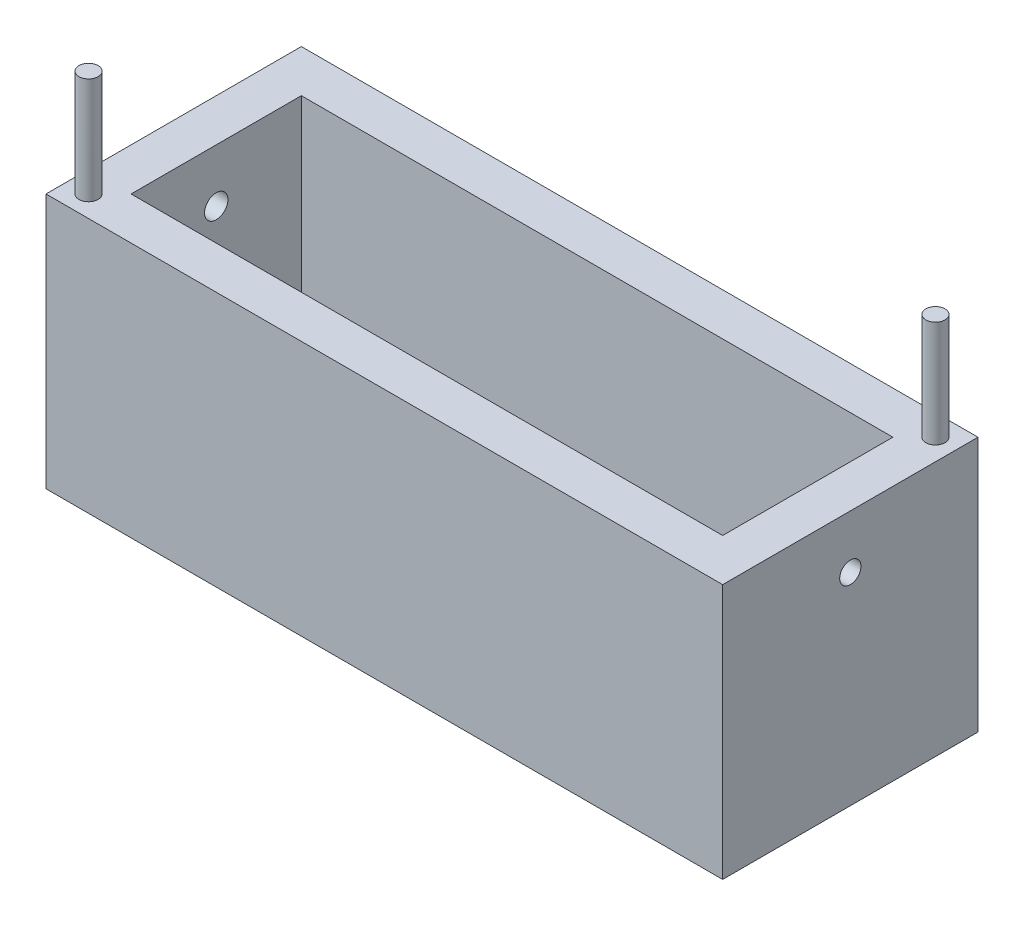
ISO-10303-21;
HEADER;
FILE_DESCRIPTION(('STEP AP214'),'2;1');
FILE_NAME('part.step','',(''),(''),'','','');
FILE_SCHEMA(('AUTOMOTIVE_DESIGN { 1 0 10303 214 1 1 1 1 }'));
ENDSEC;
DATA;
#1=APPLICATION_CONTEXT('core data for automotive mechanical design processes');
#2=APPLICATION_PROTOCOL_DEFINITION('international standard','automotive_design',2000,#1);
#3=PRODUCT_CONTEXT('',#1,'mechanical');
#4=PRODUCT('Part','Part','',(#3));
#5=PRODUCT_RELATED_PRODUCT_CATEGORY('part','',(#4));
#6=PRODUCT_DEFINITION_FORMATION('','',#4);
#7=PRODUCT_DEFINITION_CONTEXT('part definition',#1,'design');
#8=PRODUCT_DEFINITION('design','',#6,#7);
#9=PRODUCT_DEFINITION_SHAPE('','',#8);
#10=(LENGTH_UNIT() NAMED_UNIT(*) SI_UNIT(.MILLI.,.METRE.));
#11=(NAMED_UNIT(*) PLANE_ANGLE_UNIT() SI_UNIT($,.RADIAN.));
#12=(NAMED_UNIT(*) SI_UNIT($,.STERADIAN.) SOLID_ANGLE_UNIT());
#13=UNCERTAINTY_MEASURE_WITH_UNIT(LENGTH_MEASURE(1.E-05),#10,'distance_accuracy_value','');
#14=(GEOMETRIC_REPRESENTATION_CONTEXT(3) GLOBAL_UNCERTAINTY_ASSIGNED_CONTEXT((#13)) GLOBAL_UNIT_ASSIGNED_CONTEXT((#10,
#11,#12)) REPRESENTATION_CONTEXT('',''));
#15=CARTESIAN_POINT('',(0.,0.,0.));
#16=DIRECTION('',(0.,0.,1.));
#17=DIRECTION('',(1.,0.,0.));
#18=AXIS2_PLACEMENT_3D('',#15,#16,#17);
#19=CARTESIAN_POINT('',(0.,-152.4,0.));
#20=DIRECTION('',(-1.,0.,0.));
#21=DIRECTION('',(0.,0.,1.));
#22=AXIS2_PLACEMENT_3D('',#19,#20,#21);
#23=PLANE('',#22);
#24=CARTESIAN_POINT('',(0.,-31.75,-76.2));
#25=DIRECTION('',(-1.,0.,0.));
#26=DIRECTION('',(0.,0.,1.));
#27=AXIS2_PLACEMENT_3D('',#24,#25,#26);
#28=CIRCLE('',#27,6.98500000000001);
#29=CARTESIAN_POINT('',(0.,-31.75,-69.215));
#30=VERTEX_POINT('',#29);
#31=EDGE_CURVE('E225',#30,#30,#28,.T.);
#32=ORIENTED_EDGE('',*,*,#31,.F.);
#33=EDGE_LOOP('',(#32));
#34=FACE_BOUND('',#33,.T.);
#35=DIRECTION('',(0.,0.,1.));
#36=VECTOR('',#35,1.);
#37=CARTESIAN_POINT('',(0.,0.,0.));
#38=LINE('',#37,#36);
#39=CARTESIAN_POINT('',(0.,0.,-152.4));
#40=VERTEX_POINT('',#39);
#41=CARTESIAN_POINT('',(0.,0.,0.));
#42=VERTEX_POINT('',#41);
#43=EDGE_CURVE('E163',#40,#42,#38,.T.);
#44=ORIENTED_EDGE('',*,*,#43,.F.);
#45=DIRECTION('',(0.,1.,0.));
#46=VECTOR('',#45,1.);
#47=CARTESIAN_POINT('',(0.,-152.4,-152.4));
#48=LINE('',#47,#46);
#49=CARTESIAN_POINT('',(0.,-152.4,-152.4));
#50=VERTEX_POINT('',#49);
#51=EDGE_CURVE('E65',#50,#40,#48,.T.);
#52=ORIENTED_EDGE('',*,*,#51,.F.);
#53=DIRECTION('',(0.,0.,1.));
#54=VECTOR('',#53,1.);
#55=CARTESIAN_POINT('',(0.,-152.4,0.));
#56=LINE('',#55,#54);
#57=CARTESIAN_POINT('',(0.,-152.4,0.));
#58=VERTEX_POINT('',#57);
#59=EDGE_CURVE('E169',#50,#58,#56,.T.);
#60=ORIENTED_EDGE('',*,*,#59,.T.);
#61=DIRECTION('',(0.,1.,0.));
#62=VECTOR('',#61,1.);
#63=CARTESIAN_POINT('',(0.,-152.4,0.));
#64=LINE('',#63,#62);
#65=EDGE_CURVE('E91',#58,#42,#64,.T.);
#66=ORIENTED_EDGE('',*,*,#65,.T.);
#67=EDGE_LOOP('',(#44,#52,#60,#66));
#68=FACE_BOUND('',#67,.T.);
#69=ADVANCED_FACE('F39',(#34,#68),#23,.T.);
#70=CARTESIAN_POINT('',(0.,-152.4,-152.4));
#71=DIRECTION('',(0.,0.,-1.));
#72=DIRECTION('',(-1.,0.,0.));
#73=AXIS2_PLACEMENT_3D('',#70,#71,#72);
#74=PLANE('',#73);
#75=DIRECTION('',(-1.,0.,0.));
#76=VECTOR('',#75,1.);
#77=CARTESIAN_POINT('',(0.,0.,-152.4));
#78=LINE('',#77,#76);
#79=CARTESIAN_POINT('',(403.86,0.,-152.4));
#80=VERTEX_POINT('',#79);
#81=EDGE_CURVE('E173',#80,#40,#78,.T.);
#82=ORIENTED_EDGE('',*,*,#81,.F.);
#83=DIRECTION('',(0.,1.,0.));
#84=VECTOR('',#83,1.);
#85=CARTESIAN_POINT('',(403.86,-152.4,-152.4));
#86=LINE('',#85,#84);
#87=CARTESIAN_POINT('',(403.86,-152.4,-152.4));
#88=VERTEX_POINT('',#87);
#89=EDGE_CURVE('E199',#88,#80,#86,.T.);
#90=ORIENTED_EDGE('',*,*,#89,.F.);
#91=DIRECTION('',(-1.,0.,0.));
#92=VECTOR('',#91,1.);
#93=CARTESIAN_POINT('',(0.,-152.4,-152.4));
#94=LINE('',#93,#92);
#95=EDGE_CURVE('E180',#88,#50,#94,.T.);
#96=ORIENTED_EDGE('',*,*,#95,.T.);
#97=ORIENTED_EDGE('',*,*,#51,.T.);
#98=EDGE_LOOP('',(#82,#90,#96,#97));
#99=FACE_BOUND('',#98,.T.);
#100=ADVANCED_FACE('F235',(#99),#74,.T.);
#101=CARTESIAN_POINT('',(403.86,-152.4,0.));
#102=DIRECTION('',(1.,0.,0.));
#103=DIRECTION('',(0.,0.,-1.));
#104=AXIS2_PLACEMENT_3D('',#101,#102,#103);
#105=PLANE('',#104);
#106=CARTESIAN_POINT('',(403.86,-31.75,-76.2));
#107=DIRECTION('',(1.,0.,0.));
#108=DIRECTION('',(0.,0.,-1.));
#109=AXIS2_PLACEMENT_3D('',#106,#107,#108);
#110=CIRCLE('',#109,6.35);
#111=CARTESIAN_POINT('',(403.86,-31.75,-82.55));
#112=VERTEX_POINT('',#111);
#113=EDGE_CURVE('E213',#112,#112,#110,.T.);
#114=ORIENTED_EDGE('',*,*,#113,.F.);
#115=EDGE_LOOP('',(#114));
#116=FACE_BOUND('',#115,.T.);
#117=DIRECTION('',(0.,0.,-1.));
#118=VECTOR('',#117,1.);
#119=CARTESIAN_POINT('',(403.86,0.,0.));
#120=LINE('',#119,#118);
#121=CARTESIAN_POINT('',(403.86,0.,0.));
#122=VERTEX_POINT('',#121);
#123=EDGE_CURVE('E190',#122,#80,#120,.T.);
#124=ORIENTED_EDGE('',*,*,#123,.F.);
#125=DIRECTION('',(0.,1.,0.));
#126=VECTOR('',#125,1.);
#127=CARTESIAN_POINT('',(403.86,-152.4,0.));
#128=LINE('',#127,#126);
#129=CARTESIAN_POINT('',(403.86,-152.4,0.));
#130=VERTEX_POINT('',#129);
#131=EDGE_CURVE('E202',#130,#122,#128,.T.);
#132=ORIENTED_EDGE('',*,*,#131,.F.);
#133=DIRECTION('',(0.,0.,-1.));
#134=VECTOR('',#133,1.);
#135=CARTESIAN_POINT('',(403.86,-152.4,0.));
#136=LINE('',#135,#134);
#137=EDGE_CURVE('E176',#130,#88,#136,.T.);
#138=ORIENTED_EDGE('',*,*,#137,.T.);
#139=ORIENTED_EDGE('',*,*,#89,.T.);
#140=EDGE_LOOP('',(#124,#132,#138,#139));
#141=FACE_BOUND('',#140,.T.);
#142=ADVANCED_FACE('F242',(#116,#141),#105,.T.);
#143=CARTESIAN_POINT('',(0.,-152.4,0.));
#144=DIRECTION('',(0.,0.,1.));
#145=DIRECTION('',(1.,0.,0.));
#146=AXIS2_PLACEMENT_3D('',#143,#144,#145);
#147=PLANE('',#146);
#148=DIRECTION('',(1.,0.,0.));
#149=VECTOR('',#148,1.);
#150=CARTESIAN_POINT('',(0.,0.,0.));
#151=LINE('',#150,#149);
#152=EDGE_CURVE('E186',#42,#122,#151,.T.);
#153=ORIENTED_EDGE('',*,*,#152,.F.);
#154=ORIENTED_EDGE('',*,*,#65,.F.);
#155=DIRECTION('',(1.,0.,0.));
#156=VECTOR('',#155,1.);
#157=CARTESIAN_POINT('',(0.,-152.4,0.));
#158=LINE('',#157,#156);
#159=EDGE_CURVE('E172',#58,#130,#158,.T.);
#160=ORIENTED_EDGE('',*,*,#159,.T.);
#161=ORIENTED_EDGE('',*,*,#131,.T.);
#162=EDGE_LOOP('',(#153,#154,#160,#161));
#163=FACE_BOUND('',#162,.T.);
#164=ADVANCED_FACE('F245',(#163),#147,.T.);
#165=CARTESIAN_POINT('',(0.,-152.4,0.));
#166=DIRECTION('',(0.,-1.,0.));
#167=DIRECTION('',(0.,0.,-1.));
#168=AXIS2_PLACEMENT_3D('',#165,#166,#167);
#169=PLANE('',#168);
#170=ORIENTED_EDGE('',*,*,#59,.F.);
#171=ORIENTED_EDGE('',*,*,#95,.F.);
#172=ORIENTED_EDGE('',*,*,#137,.F.);
#173=ORIENTED_EDGE('',*,*,#159,.F.);
#174=EDGE_LOOP('',(#170,#171,#172,#173));
#175=FACE_BOUND('',#174,.T.);
#176=ADVANCED_FACE('F244',(#175),#169,.T.);
#177=CARTESIAN_POINT('',(0.,0.,0.));
#178=DIRECTION('',(0.,-1.,0.));
#179=DIRECTION('',(0.,0.,-1.));
#180=AXIS2_PLACEMENT_3D('',#177,#178,#179);
#181=PLANE('',#180);
#182=CARTESIAN_POINT('',(391.16,0.,-139.7));
#183=DIRECTION('',(0.,-1.,0.));
#184=DIRECTION('',(0.,0.,-1.));
#185=AXIS2_PLACEMENT_3D('',#182,#183,#184);
#186=CIRCLE('',#185,5.71500000000004);
#187=CARTESIAN_POINT('',(391.16,0.,-145.415));
#188=VERTEX_POINT('',#187);
#189=EDGE_CURVE('E11',#188,#188,#186,.F.);
#190=ORIENTED_EDGE('',*,*,#189,.F.);
#191=EDGE_LOOP('',(#190));
#192=FACE_BOUND('',#191,.T.);
#193=CARTESIAN_POINT('',(12.7,0.,-12.7));
#194=DIRECTION('',(0.,-1.,0.));
#195=DIRECTION('',(0.,0.,-1.));
#196=AXIS2_PLACEMENT_3D('',#193,#194,#195);
#197=CIRCLE('',#196,5.715);
#198=CARTESIAN_POINT('',(12.7,0.,-18.415));
#199=VERTEX_POINT('',#198);
#200=EDGE_CURVE('E48',#199,#199,#197,.F.);
#201=ORIENTED_EDGE('',*,*,#200,.F.);
#202=EDGE_LOOP('',(#201));
#203=FACE_BOUND('',#202,.T.);
#204=DIRECTION('',(1.,0.,0.));
#205=VECTOR('',#204,1.);
#206=CARTESIAN_POINT('',(25.4,0.,-25.4));
#207=LINE('',#206,#205);
#208=CARTESIAN_POINT('',(25.4,0.,-25.4));
#209=VERTEX_POINT('',#208);
#210=CARTESIAN_POINT('',(378.46,0.,-25.4));
#211=VERTEX_POINT('',#210);
#212=EDGE_CURVE('E154',#209,#211,#207,.T.);
#213=ORIENTED_EDGE('',*,*,#212,.F.);
#214=DIRECTION('',(0.,0.,1.));
#215=VECTOR('',#214,1.);
#216=CARTESIAN_POINT('',(25.4,0.,-25.4));
#217=LINE('',#216,#215);
#218=CARTESIAN_POINT('',(25.4,0.,-127.));
#219=VERTEX_POINT('',#218);
#220=EDGE_CURVE('E56',#219,#209,#217,.T.);
#221=ORIENTED_EDGE('',*,*,#220,.F.);
#222=DIRECTION('',(-1.,0.,0.));
#223=VECTOR('',#222,1.);
#224=CARTESIAN_POINT('',(25.4,0.,-127.));
#225=LINE('',#224,#223);
#226=CARTESIAN_POINT('',(378.46,0.,-127.));
#227=VERTEX_POINT('',#226);
#228=EDGE_CURVE('E138',#227,#219,#225,.T.);
#229=ORIENTED_EDGE('',*,*,#228,.F.);
#230=DIRECTION('',(0.,0.,-1.));
#231=VECTOR('',#230,1.);
#232=CARTESIAN_POINT('',(378.46,0.,-25.4));
#233=LINE('',#232,#231);
#234=EDGE_CURVE('E142',#211,#227,#233,.T.);
#235=ORIENTED_EDGE('',*,*,#234,.F.);
#236=EDGE_LOOP('',(#213,#221,#229,#235));
#237=FACE_BOUND('',#236,.T.);
#238=ORIENTED_EDGE('',*,*,#43,.T.);
#239=ORIENTED_EDGE('',*,*,#152,.T.);
#240=ORIENTED_EDGE('',*,*,#123,.T.);
#241=ORIENTED_EDGE('',*,*,#81,.T.);
#242=EDGE_LOOP('',(#238,#239,#240,#241));
#243=FACE_BOUND('',#242,.T.);
#244=ADVANCED_FACE('F237',(#192,#203,#237,#243),#181,.F.);
#245=CARTESIAN_POINT('',(25.4,-139.7,-25.4));
#246=DIRECTION('',(-1.,0.,0.));
#247=DIRECTION('',(0.,0.,1.));
#248=AXIS2_PLACEMENT_3D('',#245,#246,#247);
#249=PLANE('',#248);
#250=CARTESIAN_POINT('',(25.4,-31.75,-76.2));
#251=DIRECTION('',(-1.,0.,0.));
#252=DIRECTION('',(0.,0.,1.));
#253=AXIS2_PLACEMENT_3D('',#250,#251,#252);
#254=CIRCLE('',#253,6.98500000000001);
#255=CARTESIAN_POINT('',(25.4,-31.75,-69.215));
#256=VERTEX_POINT('',#255);
#257=EDGE_CURVE('E42',#256,#256,#254,.T.);
#258=ORIENTED_EDGE('',*,*,#257,.T.);
#259=EDGE_LOOP('',(#258));
#260=FACE_BOUND('',#259,.T.);
#261=ORIENTED_EDGE('',*,*,#220,.T.);
#262=DIRECTION('',(0.,1.,0.));
#263=VECTOR('',#262,1.);
#264=CARTESIAN_POINT('',(25.4,-139.7,-25.4));
#265=LINE('',#264,#263);
#266=CARTESIAN_POINT('',(25.4,-139.7,-25.4));
#267=VERTEX_POINT('',#266);
#268=EDGE_CURVE('E113',#267,#209,#265,.T.);
#269=ORIENTED_EDGE('',*,*,#268,.F.);
#270=DIRECTION('',(0.,0.,1.));
#271=VECTOR('',#270,1.);
#272=CARTESIAN_POINT('',(25.4,-139.7,-25.4));
#273=LINE('',#272,#271);
#274=CARTESIAN_POINT('',(25.4,-139.7,-127.));
#275=VERTEX_POINT('',#274);
#276=EDGE_CURVE('E117',#275,#267,#273,.T.);
#277=ORIENTED_EDGE('',*,*,#276,.F.);
#278=DIRECTION('',(0.,1.,0.));
#279=VECTOR('',#278,1.);
#280=CARTESIAN_POINT('',(25.4,-139.7,-127.));
#281=LINE('',#280,#279);
#282=EDGE_CURVE('E160',#275,#219,#281,.T.);
#283=ORIENTED_EDGE('',*,*,#282,.T.);
#284=EDGE_LOOP('',(#261,#269,#277,#283));
#285=FACE_BOUND('',#284,.T.);
#286=ADVANCED_FACE('F115',(#260,#285),#249,.F.);
#287=CARTESIAN_POINT('',(25.4,-139.7,-127.));
#288=DIRECTION('',(0.,0.,-1.));
#289=DIRECTION('',(-1.,0.,0.));
#290=AXIS2_PLACEMENT_3D('',#287,#288,#289);
#291=PLANE('',#290);
#292=ORIENTED_EDGE('',*,*,#228,.T.);
#293=ORIENTED_EDGE('',*,*,#282,.F.);
#294=DIRECTION('',(-1.,0.,0.));
#295=VECTOR('',#294,1.);
#296=CARTESIAN_POINT('',(25.4,-139.7,-127.));
#297=LINE('',#296,#295);
#298=CARTESIAN_POINT('',(378.46,-139.7,-127.));
#299=VERTEX_POINT('',#298);
#300=EDGE_CURVE('E124',#299,#275,#297,.T.);
#301=ORIENTED_EDGE('',*,*,#300,.F.);
#302=DIRECTION('',(0.,1.,0.));
#303=VECTOR('',#302,1.);
#304=CARTESIAN_POINT('',(378.46,-139.7,-127.));
#305=LINE('',#304,#303);
#306=EDGE_CURVE('E164',#299,#227,#305,.T.);
#307=ORIENTED_EDGE('',*,*,#306,.T.);
#308=EDGE_LOOP('',(#292,#293,#301,#307));
#309=FACE_BOUND('',#308,.T.);
#310=ADVANCED_FACE('F262',(#309),#291,.F.);
#311=CARTESIAN_POINT('',(378.46,-139.7,-25.4));
#312=DIRECTION('',(1.,0.,0.));
#313=DIRECTION('',(0.,0.,-1.));
#314=AXIS2_PLACEMENT_3D('',#311,#312,#313);
#315=PLANE('',#314);
#316=CARTESIAN_POINT('',(378.46,-31.75,-76.2));
#317=DIRECTION('',(1.,0.,0.));
#318=DIRECTION('',(0.,0.,-1.));
#319=AXIS2_PLACEMENT_3D('',#316,#317,#318);
#320=CIRCLE('',#319,6.35);
#321=CARTESIAN_POINT('',(378.46,-31.75,-82.55));
#322=VERTEX_POINT('',#321);
#323=EDGE_CURVE('E209',#322,#322,#320,.T.);
#324=ORIENTED_EDGE('',*,*,#323,.T.);
#325=EDGE_LOOP('',(#324));
#326=FACE_BOUND('',#325,.T.);
#327=ORIENTED_EDGE('',*,*,#234,.T.);
#328=ORIENTED_EDGE('',*,*,#306,.F.);
#329=DIRECTION('',(0.,0.,-1.));
#330=VECTOR('',#329,1.);
#331=CARTESIAN_POINT('',(378.46,-139.7,-25.4));
#332=LINE('',#331,#330);
#333=CARTESIAN_POINT('',(378.46,-139.7,-25.4));
#334=VERTEX_POINT('',#333);
#335=EDGE_CURVE('E133',#334,#299,#332,.T.);
#336=ORIENTED_EDGE('',*,*,#335,.F.);
#337=DIRECTION('',(0.,1.,0.));
#338=VECTOR('',#337,1.);
#339=CARTESIAN_POINT('',(378.46,-139.7,-25.4));
#340=LINE('',#339,#338);
#341=EDGE_CURVE('E123',#334,#211,#340,.T.);
#342=ORIENTED_EDGE('',*,*,#341,.T.);
#343=EDGE_LOOP('',(#327,#328,#336,#342));
#344=FACE_BOUND('',#343,.T.);
#345=ADVANCED_FACE('F266',(#326,#344),#315,.F.);
#346=CARTESIAN_POINT('',(25.4,-139.7,-25.4));
#347=DIRECTION('',(0.,0.,1.));
#348=DIRECTION('',(1.,0.,0.));
#349=AXIS2_PLACEMENT_3D('',#346,#347,#348);
#350=PLANE('',#349);
#351=ORIENTED_EDGE('',*,*,#212,.T.);
#352=ORIENTED_EDGE('',*,*,#341,.F.);
#353=DIRECTION('',(1.,0.,0.));
#354=VECTOR('',#353,1.);
#355=CARTESIAN_POINT('',(25.4,-139.7,-25.4));
#356=LINE('',#355,#354);
#357=EDGE_CURVE('E127',#267,#334,#356,.T.);
#358=ORIENTED_EDGE('',*,*,#357,.F.);
#359=ORIENTED_EDGE('',*,*,#268,.T.);
#360=EDGE_LOOP('',(#351,#352,#358,#359));
#361=FACE_BOUND('',#360,.T.);
#362=ADVANCED_FACE('F128',(#361),#350,.F.);
#363=CARTESIAN_POINT('',(0.,-139.7,0.));
#364=DIRECTION('',(0.,-1.,0.));
#365=DIRECTION('',(0.,0.,-1.));
#366=AXIS2_PLACEMENT_3D('',#363,#364,#365);
#367=PLANE('',#366);
#368=ORIENTED_EDGE('',*,*,#276,.T.);
#369=ORIENTED_EDGE('',*,*,#357,.T.);
#370=ORIENTED_EDGE('',*,*,#335,.T.);
#371=ORIENTED_EDGE('',*,*,#300,.T.);
#372=EDGE_LOOP('',(#368,#369,#370,#371));
#373=FACE_BOUND('',#372,.T.);
#374=ADVANCED_FACE('F135',(#373),#367,.F.);
#375=CARTESIAN_POINT('',(12.7,63.5,-12.7));
#376=DIRECTION('',(0.,-1.,0.));
#377=DIRECTION('',(0.,0.,-1.));
#378=AXIS2_PLACEMENT_3D('',#375,#376,#377);
#379=CYLINDRICAL_SURFACE('',#378,5.715);
#380=CARTESIAN_POINT('',(12.7,63.5,-12.7));
#381=DIRECTION('',(0.,1.,0.));
#382=DIRECTION('',(0.,0.,1.));
#383=AXIS2_PLACEMENT_3D('',#380,#381,#382);
#384=CIRCLE('',#383,5.715);
#385=CARTESIAN_POINT('',(12.7,63.5,-6.98499999999999));
#386=VERTEX_POINT('',#385);
#387=EDGE_CURVE('E145',#386,#386,#384,.T.);
#388=ORIENTED_EDGE('',*,*,#387,.F.);
#389=EDGE_LOOP('',(#388));
#390=FACE_BOUND('',#389,.T.);
#391=ORIENTED_EDGE('',*,*,#200,.T.);
#392=EDGE_LOOP('',(#391));
#393=FACE_BOUND('',#392,.T.);
#394=ADVANCED_FACE('F274',(#390,#393),#379,.T.);
#395=CARTESIAN_POINT('',(12.7,63.5,-12.7));
#396=DIRECTION('',(0.,1.,0.));
#397=DIRECTION('',(0.,0.,1.));
#398=AXIS2_PLACEMENT_3D('',#395,#396,#397);
#399=PLANE('',#398);
#400=ORIENTED_EDGE('',*,*,#387,.T.);
#401=EDGE_LOOP('',(#400));
#402=FACE_BOUND('',#401,.T.);
#403=ADVANCED_FACE('F277',(#402),#399,.T.);
#404=CARTESIAN_POINT('',(391.16,63.5,-139.7));
#405=DIRECTION('',(0.,-1.,0.));
#406=DIRECTION('',(0.,0.,-1.));
#407=AXIS2_PLACEMENT_3D('',#404,#405,#406);
#408=CYLINDRICAL_SURFACE('',#407,5.71500000000004);
#409=CARTESIAN_POINT('',(391.16,63.5,-139.7));
#410=DIRECTION('',(0.,1.,0.));
#411=DIRECTION('',(0.,0.,1.));
#412=AXIS2_PLACEMENT_3D('',#409,#410,#411);
#413=CIRCLE('',#412,5.71500000000004);
#414=CARTESIAN_POINT('',(391.16,63.5,-133.985));
#415=VERTEX_POINT('',#414);
#416=EDGE_CURVE('E212',#415,#415,#413,.T.);
#417=ORIENTED_EDGE('',*,*,#416,.F.);
#418=EDGE_LOOP('',(#417));
#419=FACE_BOUND('',#418,.T.);
#420=ORIENTED_EDGE('',*,*,#189,.T.);
#421=EDGE_LOOP('',(#420));
#422=FACE_BOUND('',#421,.T.);
#423=ADVANCED_FACE('F281',(#419,#422),#408,.T.);
#424=CARTESIAN_POINT('',(391.16,63.5,-139.7));
#425=DIRECTION('',(0.,1.,0.));
#426=DIRECTION('',(0.,0.,1.));
#427=AXIS2_PLACEMENT_3D('',#424,#425,#426);
#428=PLANE('',#427);
#429=ORIENTED_EDGE('',*,*,#416,.T.);
#430=EDGE_LOOP('',(#429));
#431=FACE_BOUND('',#430,.T.);
#432=ADVANCED_FACE('F285',(#431),#428,.T.);
#433=CARTESIAN_POINT('',(340.36,-31.75,-76.2));
#434=DIRECTION('',(1.,0.,0.));
#435=DIRECTION('',(0.,0.,-1.));
#436=AXIS2_PLACEMENT_3D('',#433,#434,#435);
#437=CYLINDRICAL_SURFACE('',#436,6.35);
#438=ORIENTED_EDGE('',*,*,#113,.T.);
#439=EDGE_LOOP('',(#438));
#440=FACE_BOUND('',#439,.T.);
#441=ORIENTED_EDGE('',*,*,#323,.F.);
#442=EDGE_LOOP('',(#441));
#443=FACE_BOUND('',#442,.T.);
#444=ADVANCED_FACE('F289',(#440,#443),#437,.F.);
#445=CARTESIAN_POINT('',(63.5,-31.75,-76.2));
#446=DIRECTION('',(-1.,0.,0.));
#447=DIRECTION('',(0.,0.,1.));
#448=AXIS2_PLACEMENT_3D('',#445,#446,#447);
#449=CYLINDRICAL_SURFACE('',#448,6.98500000000001);
#450=ORIENTED_EDGE('',*,*,#31,.T.);
#451=EDGE_LOOP('',(#450));
#452=FACE_BOUND('',#451,.T.);
#453=ORIENTED_EDGE('',*,*,#257,.F.);
#454=EDGE_LOOP('',(#453));
#455=FACE_BOUND('',#454,.T.);
#456=ADVANCED_FACE('F231',(#452,#455),#449,.F.);
#457=CLOSED_SHELL('',(#69,#100,#142,#164,#176,#244,#286,#310,#345,#362,#374,#394,#403,#423,#432,
#444,#456));
#458=MANIFOLD_SOLID_BREP('B2',#457);
#459=ADVANCED_BREP_SHAPE_REPRESENTATION('',(#18,#458),#14);
#460=SHAPE_DEFINITION_REPRESENTATION(#9,#459);
ENDSEC;
END-ISO-10303-21;
